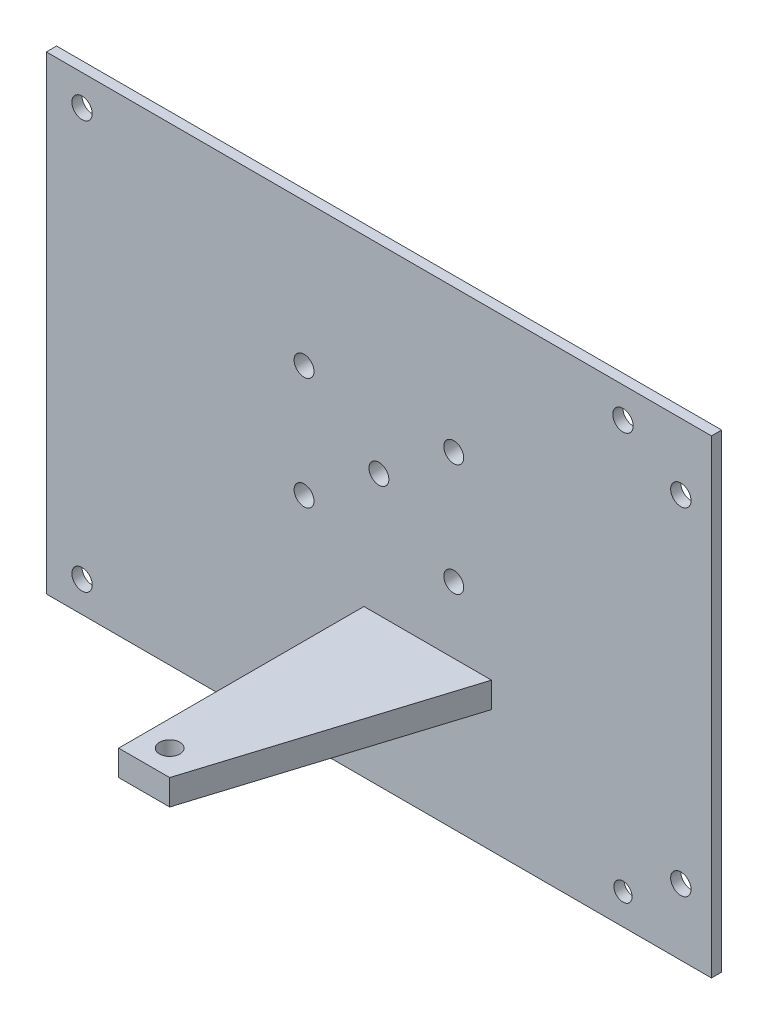
ISO-10303-21;
HEADER;
FILE_DESCRIPTION(('STEP AP214'),'2;1');
FILE_NAME('part.step','',(''),(''),'','','');
FILE_SCHEMA(('AUTOMOTIVE_DESIGN { 1 0 10303 214 1 1 1 1 }'));
ENDSEC;
DATA;
#1=APPLICATION_CONTEXT('core data for automotive mechanical design processes');
#2=APPLICATION_PROTOCOL_DEFINITION('international standard','automotive_design',2000,#1);
#3=PRODUCT_CONTEXT('',#1,'mechanical');
#4=PRODUCT('Part','Part','',(#3));
#5=PRODUCT_RELATED_PRODUCT_CATEGORY('part','',(#4));
#6=PRODUCT_DEFINITION_FORMATION('','',#4);
#7=PRODUCT_DEFINITION_CONTEXT('part definition',#1,'design');
#8=PRODUCT_DEFINITION('design','',#6,#7);
#9=PRODUCT_DEFINITION_SHAPE('','',#8);
#10=(LENGTH_UNIT() NAMED_UNIT(*) SI_UNIT(.MILLI.,.METRE.));
#11=(NAMED_UNIT(*) PLANE_ANGLE_UNIT() SI_UNIT($,.RADIAN.));
#12=(NAMED_UNIT(*) SI_UNIT($,.STERADIAN.) SOLID_ANGLE_UNIT());
#13=UNCERTAINTY_MEASURE_WITH_UNIT(LENGTH_MEASURE(1.E-05),#10,'distance_accuracy_value','');
#14=(GEOMETRIC_REPRESENTATION_CONTEXT(3) GLOBAL_UNCERTAINTY_ASSIGNED_CONTEXT((#13)) GLOBAL_UNIT_ASSIGNED_CONTEXT((#10,
#11,#12)) REPRESENTATION_CONTEXT('',''));
#15=CARTESIAN_POINT('',(0.,0.,0.));
#16=DIRECTION('',(0.,0.,1.));
#17=DIRECTION('',(1.,0.,0.));
#18=AXIS2_PLACEMENT_3D('',#15,#16,#17);
#19=CARTESIAN_POINT('',(0.,0.,-1.));
#20=DIRECTION('',(0.,0.,-1.));
#21=DIRECTION('',(-1.,0.,0.));
#22=AXIS2_PLACEMENT_3D('',#19,#20,#21);
#23=PLANE('',#22);
#24=CARTESIAN_POINT('',(113.,83.,-1.));
#25=DIRECTION('',(0.,0.,1.));
#26=DIRECTION('',(1.,0.,0.));
#27=AXIS2_PLACEMENT_3D('',#24,#25,#26);
#28=CIRCLE('',#27,2.);
#29=CARTESIAN_POINT('',(115.,83.,-1.));
#30=VERTEX_POINT('',#29);
#31=EDGE_CURVE('E184',#30,#30,#28,.T.);
#32=ORIENTED_EDGE('',*,*,#31,.T.);
#33=EDGE_LOOP('',(#32));
#34=FACE_BOUND('',#33,.T.);
#35=CARTESIAN_POINT('',(7.,3.,-1.));
#36=DIRECTION('',(0.,0.,1.));
#37=DIRECTION('',(1.,0.,0.));
#38=AXIS2_PLACEMENT_3D('',#35,#36,#37);
#39=CIRCLE('',#38,2.);
#40=CARTESIAN_POINT('',(9.,3.,-1.));
#41=VERTEX_POINT('',#40);
#42=EDGE_CURVE('E199',#41,#41,#39,.T.);
#43=ORIENTED_EDGE('',*,*,#42,.T.);
#44=EDGE_LOOP('',(#43));
#45=FACE_BOUND('',#44,.T.);
#46=CARTESIAN_POINT('',(124.33985981,76.,-1.));
#47=DIRECTION('',(0.,0.,1.));
#48=DIRECTION('',(1.,0.,0.));
#49=AXIS2_PLACEMENT_3D('',#46,#47,#48);
#50=CIRCLE('',#49,2.);
#51=CARTESIAN_POINT('',(126.33985981,76.,-1.));
#52=VERTEX_POINT('',#51);
#53=EDGE_CURVE('E211',#52,#52,#50,.T.);
#54=ORIENTED_EDGE('',*,*,#53,.T.);
#55=EDGE_LOOP('',(#54));
#56=FACE_BOUND('',#55,.T.);
#57=DIRECTION('',(0.,-1.,0.));
#58=VECTOR('',#57,1.);
#59=CARTESIAN_POINT('',(0.,-3.,-1.));
#60=LINE('',#59,#58);
#61=CARTESIAN_POINT('',(0.,89.,-1.));
#62=VERTEX_POINT('',#61);
#63=CARTESIAN_POINT('',(0.,-3.,-1.));
#64=VERTEX_POINT('',#63);
#65=EDGE_CURVE('E228',#62,#64,#60,.T.);
#66=ORIENTED_EDGE('',*,*,#65,.F.);
#67=DIRECTION('',(-1.,0.,0.));
#68=VECTOR('',#67,1.);
#69=CARTESIAN_POINT('',(0.,89.,-1.));
#70=LINE('',#69,#68);
#71=CARTESIAN_POINT('',(130.33985981,89.,-1.));
#72=VERTEX_POINT('',#71);
#73=EDGE_CURVE('E233',#72,#62,#70,.T.);
#74=ORIENTED_EDGE('',*,*,#73,.F.);
#75=DIRECTION('',(0.,1.,0.));
#76=VECTOR('',#75,1.);
#77=CARTESIAN_POINT('',(130.33985981,-3.,-1.));
#78=LINE('',#77,#76);
#79=CARTESIAN_POINT('',(130.33985981,-3.,-1.));
#80=VERTEX_POINT('',#79);
#81=EDGE_CURVE('E244',#80,#72,#78,.T.);
#82=ORIENTED_EDGE('',*,*,#81,.F.);
#83=DIRECTION('',(1.,0.,0.));
#84=VECTOR('',#83,1.);
#85=CARTESIAN_POINT('',(0.,-3.,-1.));
#86=LINE('',#85,#84);
#87=EDGE_CURVE('E242',#64,#80,#86,.T.);
#88=ORIENTED_EDGE('',*,*,#87,.F.);
#89=EDGE_LOOP('',(#66,#74,#82,#88));
#90=FACE_BOUND('',#89,.T.);
#91=CARTESIAN_POINT('',(124.33985981,10.,-1.));
#92=DIRECTION('',(0.,0.,1.));
#93=DIRECTION('',(1.,0.,0.));
#94=AXIS2_PLACEMENT_3D('',#91,#92,#93);
#95=CIRCLE('',#94,2.);
#96=CARTESIAN_POINT('',(126.33985981,10.,-1.));
#97=VERTEX_POINT('',#96);
#98=EDGE_CURVE('E217',#97,#97,#95,.T.);
#99=ORIENTED_EDGE('',*,*,#98,.T.);
#100=EDGE_LOOP('',(#99));
#101=FACE_BOUND('',#100,.T.);
#102=CARTESIAN_POINT('',(113.,3.,-1.));
#103=DIRECTION('',(0.,0.,1.));
#104=DIRECTION('',(1.,0.,0.));
#105=AXIS2_PLACEMENT_3D('',#102,#103,#104);
#106=CIRCLE('',#105,1.78558252323541);
#107=CARTESIAN_POINT('',(114.785582523235,3.,-1.));
#108=VERTEX_POINT('',#107);
#109=EDGE_CURVE('E205',#108,#108,#106,.T.);
#110=ORIENTED_EDGE('',*,*,#109,.T.);
#111=EDGE_LOOP('',(#110));
#112=FACE_BOUND('',#111,.T.);
#113=CARTESIAN_POINT('',(7.,83.,-1.));
#114=DIRECTION('',(0.,0.,1.));
#115=DIRECTION('',(1.,0.,0.));
#116=AXIS2_PLACEMENT_3D('',#113,#114,#115);
#117=CIRCLE('',#116,2.);
#118=CARTESIAN_POINT('',(9.,83.,-1.));
#119=VERTEX_POINT('',#118);
#120=EDGE_CURVE('E193',#119,#119,#117,.T.);
#121=ORIENTED_EDGE('',*,*,#120,.T.);
#122=EDGE_LOOP('',(#121));
#123=FACE_BOUND('',#122,.T.);
#124=DIRECTION('',(1.,0.,0.));
#125=VECTOR('',#124,1.);
#126=CARTESIAN_POINT('',(85.169929905,65.,-1.));
#127=LINE('',#126,#125);
#128=CARTESIAN_POINT('',(45.169929905,65.,-1.));
#129=VERTEX_POINT('',#128);
#130=CARTESIAN_POINT('',(85.169929905,65.,-1.));
#131=VERTEX_POINT('',#130);
#132=EDGE_CURVE('E416',#129,#131,#127,.T.);
#133=ORIENTED_EDGE('',*,*,#132,.F.);
#134=DIRECTION('',(0.,1.,0.));
#135=VECTOR('',#134,1.);
#136=CARTESIAN_POINT('',(45.169929905,65.,-1.));
#137=LINE('',#136,#135);
#138=CARTESIAN_POINT('',(45.169929905,35.,-1.));
#139=VERTEX_POINT('',#138);
#140=EDGE_CURVE('E147',#139,#129,#137,.T.);
#141=ORIENTED_EDGE('',*,*,#140,.F.);
#142=DIRECTION('',(-1.,0.,0.));
#143=VECTOR('',#142,1.);
#144=CARTESIAN_POINT('',(85.169929905,35.,-1.));
#145=LINE('',#144,#143);
#146=CARTESIAN_POINT('',(85.169929905,35.,-1.));
#147=VERTEX_POINT('',#146);
#148=EDGE_CURVE('E143',#147,#139,#145,.T.);
#149=ORIENTED_EDGE('',*,*,#148,.F.);
#150=DIRECTION('',(0.,-1.,0.));
#151=VECTOR('',#150,1.);
#152=CARTESIAN_POINT('',(85.169929905,65.,-1.));
#153=LINE('',#152,#151);
#154=EDGE_CURVE('E418',#131,#147,#153,.T.);
#155=ORIENTED_EDGE('',*,*,#154,.F.);
#156=EDGE_LOOP('',(#133,#141,#149,#155));
#157=FACE_BOUND('',#156,.T.);
#158=ADVANCED_FACE('F34',(#34,#45,#56,#90,#101,#112,#123,#157),#23,.T.);
#159=CARTESIAN_POINT('',(0.,0.,1.));
#160=DIRECTION('',(0.,0.,-1.));
#161=DIRECTION('',(-1.,0.,0.));
#162=AXIS2_PLACEMENT_3D('',#159,#160,#161);
#163=PLANE('',#162);
#164=CARTESIAN_POINT('',(50.5032632383334,61.,1.));
#165=DIRECTION('',(0.,0.,-1.));
#166=DIRECTION('',(-1.,0.,0.));
#167=AXIS2_PLACEMENT_3D('',#164,#165,#166);
#168=CIRCLE('',#167,1.95000000000001);
#169=CARTESIAN_POINT('',(48.5532632383334,61.,1.));
#170=VERTEX_POINT('',#169);
#171=EDGE_CURVE('E395',#170,#170,#168,.T.);
#172=ORIENTED_EDGE('',*,*,#171,.T.);
#173=EDGE_LOOP('',(#172));
#174=FACE_BOUND('',#173,.T.);
#175=CARTESIAN_POINT('',(79.8365965716667,61.,1.));
#176=DIRECTION('',(0.,0.,-1.));
#177=DIRECTION('',(-1.,0.,0.));
#178=AXIS2_PLACEMENT_3D('',#175,#176,#177);
#179=CIRCLE('',#178,1.94999999999999);
#180=CARTESIAN_POINT('',(77.8865965716667,61.,1.));
#181=VERTEX_POINT('',#180);
#182=EDGE_CURVE('E389',#181,#181,#179,.T.);
#183=ORIENTED_EDGE('',*,*,#182,.T.);
#184=EDGE_LOOP('',(#183));
#185=FACE_BOUND('',#184,.T.);
#186=CARTESIAN_POINT('',(79.8365965716667,39.,1.));
#187=DIRECTION('',(0.,0.,-1.));
#188=DIRECTION('',(-1.,0.,0.));
#189=AXIS2_PLACEMENT_3D('',#186,#187,#188);
#190=CIRCLE('',#189,1.95);
#191=CARTESIAN_POINT('',(77.8865965716667,39.,1.));
#192=VERTEX_POINT('',#191);
#193=EDGE_CURVE('E386',#192,#192,#190,.T.);
#194=ORIENTED_EDGE('',*,*,#193,.T.);
#195=EDGE_LOOP('',(#194));
#196=FACE_BOUND('',#195,.T.);
#197=CARTESIAN_POINT('',(50.5032632383334,39.,1.));
#198=DIRECTION('',(0.,0.,-1.));
#199=DIRECTION('',(-1.,0.,0.));
#200=AXIS2_PLACEMENT_3D('',#197,#198,#199);
#201=CIRCLE('',#200,1.95);
#202=CARTESIAN_POINT('',(48.5532632383334,39.,1.));
#203=VERTEX_POINT('',#202);
#204=EDGE_CURVE('E388',#203,#203,#201,.T.);
#205=ORIENTED_EDGE('',*,*,#204,.T.);
#206=EDGE_LOOP('',(#205));
#207=FACE_BOUND('',#206,.T.);
#208=DIRECTION('',(0.,-1.,0.));
#209=VECTOR('',#208,1.);
#210=CARTESIAN_POINT('',(62.24,26.,1.));
#211=LINE('',#210,#209);
#212=CARTESIAN_POINT('',(62.24,26.,1.));
#213=VERTEX_POINT('',#212);
#214=CARTESIAN_POINT('',(62.24,21.,1.));
#215=VERTEX_POINT('',#214);
#216=EDGE_CURVE('E57',#213,#215,#211,.T.);
#217=ORIENTED_EDGE('',*,*,#216,.F.);
#218=DIRECTION('',(1.,0.,0.));
#219=VECTOR('',#218,1.);
#220=CARTESIAN_POINT('',(62.24,26.,1.));
#221=LINE('',#220,#219);
#222=CARTESIAN_POINT('',(87.24,26.,1.));
#223=VERTEX_POINT('',#222);
#224=EDGE_CURVE('E160',#213,#223,#221,.T.);
#225=ORIENTED_EDGE('',*,*,#224,.T.);
#226=DIRECTION('',(0.,-1.,0.));
#227=VECTOR('',#226,1.);
#228=CARTESIAN_POINT('',(87.24,26.,1.));
#229=LINE('',#228,#227);
#230=CARTESIAN_POINT('',(87.24,21.,1.));
#231=VERTEX_POINT('',#230);
#232=EDGE_CURVE('E172',#223,#231,#229,.T.);
#233=ORIENTED_EDGE('',*,*,#232,.T.);
#234=DIRECTION('',(1.,0.,0.));
#235=VECTOR('',#234,1.);
#236=CARTESIAN_POINT('',(62.24,21.,1.));
#237=LINE('',#236,#235);
#238=EDGE_CURVE('E158',#215,#231,#237,.T.);
#239=ORIENTED_EDGE('',*,*,#238,.F.);
#240=EDGE_LOOP('',(#217,#225,#233,#239));
#241=FACE_BOUND('',#240,.T.);
#242=DIRECTION('',(0.,-1.,0.));
#243=VECTOR('',#242,1.);
#244=CARTESIAN_POINT('',(0.,-3.,1.));
#245=LINE('',#244,#243);
#246=CARTESIAN_POINT('',(0.,89.,1.));
#247=VERTEX_POINT('',#246);
#248=CARTESIAN_POINT('',(0.,-3.,1.));
#249=VERTEX_POINT('',#248);
#250=EDGE_CURVE('E229',#247,#249,#245,.T.);
#251=ORIENTED_EDGE('',*,*,#250,.T.);
#252=DIRECTION('',(1.,0.,0.));
#253=VECTOR('',#252,1.);
#254=CARTESIAN_POINT('',(0.,-3.,1.));
#255=LINE('',#254,#253);
#256=CARTESIAN_POINT('',(130.33985981,-3.,1.));
#257=VERTEX_POINT('',#256);
#258=EDGE_CURVE('E232',#249,#257,#255,.T.);
#259=ORIENTED_EDGE('',*,*,#258,.T.);
#260=DIRECTION('',(0.,1.,0.));
#261=VECTOR('',#260,1.);
#262=CARTESIAN_POINT('',(130.33985981,-3.,1.));
#263=LINE('',#262,#261);
#264=CARTESIAN_POINT('',(130.33985981,89.,1.));
#265=VERTEX_POINT('',#264);
#266=EDGE_CURVE('E235',#257,#265,#263,.T.);
#267=ORIENTED_EDGE('',*,*,#266,.T.);
#268=DIRECTION('',(-1.,0.,0.));
#269=VECTOR('',#268,1.);
#270=CARTESIAN_POINT('',(0.,89.,1.));
#271=LINE('',#270,#269);
#272=EDGE_CURVE('E237',#265,#247,#271,.T.);
#273=ORIENTED_EDGE('',*,*,#272,.T.);
#274=EDGE_LOOP('',(#251,#259,#267,#273));
#275=FACE_BOUND('',#274,.T.);
#276=CARTESIAN_POINT('',(65.169929905,50.,1.));
#277=DIRECTION('',(0.,0.,1.));
#278=DIRECTION('',(1.,0.,0.));
#279=AXIS2_PLACEMENT_3D('',#276,#277,#278);
#280=CIRCLE('',#279,1.95);
#281=CARTESIAN_POINT('',(67.119929905,50.,1.));
#282=VERTEX_POINT('',#281);
#283=EDGE_CURVE('E223',#282,#282,#280,.T.);
#284=ORIENTED_EDGE('',*,*,#283,.F.);
#285=EDGE_LOOP('',(#284));
#286=FACE_BOUND('',#285,.T.);
#287=CARTESIAN_POINT('',(124.33985981,10.,1.));
#288=DIRECTION('',(0.,0.,1.));
#289=DIRECTION('',(1.,0.,0.));
#290=AXIS2_PLACEMENT_3D('',#287,#288,#289);
#291=CIRCLE('',#290,2.);
#292=CARTESIAN_POINT('',(126.33985981,10.,1.));
#293=VERTEX_POINT('',#292);
#294=EDGE_CURVE('E220',#293,#293,#291,.T.);
#295=ORIENTED_EDGE('',*,*,#294,.F.);
#296=EDGE_LOOP('',(#295));
#297=FACE_BOUND('',#296,.T.);
#298=CARTESIAN_POINT('',(124.33985981,76.,1.));
#299=DIRECTION('',(0.,0.,1.));
#300=DIRECTION('',(1.,0.,0.));
#301=AXIS2_PLACEMENT_3D('',#298,#299,#300);
#302=CIRCLE('',#301,2.);
#303=CARTESIAN_POINT('',(126.33985981,76.,1.));
#304=VERTEX_POINT('',#303);
#305=EDGE_CURVE('E214',#304,#304,#302,.T.);
#306=ORIENTED_EDGE('',*,*,#305,.F.);
#307=EDGE_LOOP('',(#306));
#308=FACE_BOUND('',#307,.T.);
#309=CARTESIAN_POINT('',(113.,3.,1.));
#310=DIRECTION('',(0.,0.,1.));
#311=DIRECTION('',(1.,0.,0.));
#312=AXIS2_PLACEMENT_3D('',#309,#310,#311);
#313=CIRCLE('',#312,1.78558252323541);
#314=CARTESIAN_POINT('',(114.785582523235,3.,1.));
#315=VERTEX_POINT('',#314);
#316=EDGE_CURVE('E208',#315,#315,#313,.T.);
#317=ORIENTED_EDGE('',*,*,#316,.F.);
#318=EDGE_LOOP('',(#317));
#319=FACE_BOUND('',#318,.T.);
#320=CARTESIAN_POINT('',(7.,3.,1.));
#321=DIRECTION('',(0.,0.,1.));
#322=DIRECTION('',(1.,0.,0.));
#323=AXIS2_PLACEMENT_3D('',#320,#321,#322);
#324=CIRCLE('',#323,2.);
#325=CARTESIAN_POINT('',(9.,3.,1.));
#326=VERTEX_POINT('',#325);
#327=EDGE_CURVE('E202',#326,#326,#324,.T.);
#328=ORIENTED_EDGE('',*,*,#327,.F.);
#329=EDGE_LOOP('',(#328));
#330=FACE_BOUND('',#329,.T.);
#331=CARTESIAN_POINT('',(7.,83.,1.));
#332=DIRECTION('',(0.,0.,1.));
#333=DIRECTION('',(1.,0.,0.));
#334=AXIS2_PLACEMENT_3D('',#331,#332,#333);
#335=CIRCLE('',#334,2.);
#336=CARTESIAN_POINT('',(9.,83.,1.));
#337=VERTEX_POINT('',#336);
#338=EDGE_CURVE('E196',#337,#337,#335,.T.);
#339=ORIENTED_EDGE('',*,*,#338,.F.);
#340=EDGE_LOOP('',(#339));
#341=FACE_BOUND('',#340,.T.);
#342=CARTESIAN_POINT('',(113.,83.,1.));
#343=DIRECTION('',(0.,0.,1.));
#344=DIRECTION('',(1.,0.,0.));
#345=AXIS2_PLACEMENT_3D('',#342,#343,#344);
#346=CIRCLE('',#345,2.);
#347=CARTESIAN_POINT('',(115.,83.,1.));
#348=VERTEX_POINT('',#347);
#349=EDGE_CURVE('E190',#348,#348,#346,.T.);
#350=ORIENTED_EDGE('',*,*,#349,.F.);
#351=EDGE_LOOP('',(#350));
#352=FACE_BOUND('',#351,.T.);
#353=ADVANCED_FACE('F271',(#174,#185,#196,#207,#241,#275,#286,#297,#308,#319,#330,#341,#352),
#163,.F.);
#354=CARTESIAN_POINT('',(0.,-3.,1.));
#355=DIRECTION('',(1.,0.,0.));
#356=DIRECTION('',(0.,0.,-1.));
#357=AXIS2_PLACEMENT_3D('',#354,#355,#356);
#358=PLANE('',#357);
#359=ORIENTED_EDGE('',*,*,#65,.T.);
#360=DIRECTION('',(0.,0.,-1.));
#361=VECTOR('',#360,1.);
#362=CARTESIAN_POINT('',(0.,-3.,1.));
#363=LINE('',#362,#361);
#364=EDGE_CURVE('E11',#249,#64,#363,.T.);
#365=ORIENTED_EDGE('',*,*,#364,.F.);
#366=ORIENTED_EDGE('',*,*,#250,.F.);
#367=DIRECTION('',(0.,0.,-1.));
#368=VECTOR('',#367,1.);
#369=CARTESIAN_POINT('',(0.,89.,1.));
#370=LINE('',#369,#368);
#371=EDGE_CURVE('E239',#247,#62,#370,.T.);
#372=ORIENTED_EDGE('',*,*,#371,.T.);
#373=EDGE_LOOP('',(#359,#365,#366,#372));
#374=FACE_BOUND('',#373,.T.);
#375=ADVANCED_FACE('F36',(#374),#358,.F.);
#376=CARTESIAN_POINT('',(0.,-3.,1.));
#377=DIRECTION('',(0.,1.,0.));
#378=DIRECTION('',(0.,0.,1.));
#379=AXIS2_PLACEMENT_3D('',#376,#377,#378);
#380=PLANE('',#379);
#381=ORIENTED_EDGE('',*,*,#87,.T.);
#382=DIRECTION('',(0.,0.,-1.));
#383=VECTOR('',#382,1.);
#384=CARTESIAN_POINT('',(130.33985981,-3.,1.));
#385=LINE('',#384,#383);
#386=EDGE_CURVE('E42',#257,#80,#385,.T.);
#387=ORIENTED_EDGE('',*,*,#386,.F.);
#388=ORIENTED_EDGE('',*,*,#258,.F.);
#389=ORIENTED_EDGE('',*,*,#364,.T.);
#390=EDGE_LOOP('',(#381,#387,#388,#389));
#391=FACE_BOUND('',#390,.T.);
#392=ADVANCED_FACE('F273',(#391),#380,.F.);
#393=CARTESIAN_POINT('',(130.33985981,-3.,1.));
#394=DIRECTION('',(-1.,0.,0.));
#395=DIRECTION('',(0.,-1.,0.));
#396=AXIS2_PLACEMENT_3D('',#393,#394,#395);
#397=PLANE('',#396);
#398=ORIENTED_EDGE('',*,*,#81,.T.);
#399=DIRECTION('',(0.,0.,-1.));
#400=VECTOR('',#399,1.);
#401=CARTESIAN_POINT('',(130.33985981,89.,1.));
#402=LINE('',#401,#400);
#403=EDGE_CURVE('E249',#265,#72,#402,.T.);
#404=ORIENTED_EDGE('',*,*,#403,.F.);
#405=ORIENTED_EDGE('',*,*,#266,.F.);
#406=ORIENTED_EDGE('',*,*,#386,.T.);
#407=EDGE_LOOP('',(#398,#404,#405,#406));
#408=FACE_BOUND('',#407,.T.);
#409=ADVANCED_FACE('F256',(#408),#397,.F.);
#410=CARTESIAN_POINT('',(0.,89.,1.));
#411=DIRECTION('',(0.,-1.,0.));
#412=DIRECTION('',(0.,0.,-1.));
#413=AXIS2_PLACEMENT_3D('',#410,#411,#412);
#414=PLANE('',#413);
#415=ORIENTED_EDGE('',*,*,#73,.T.);
#416=ORIENTED_EDGE('',*,*,#371,.F.);
#417=ORIENTED_EDGE('',*,*,#272,.F.);
#418=ORIENTED_EDGE('',*,*,#403,.T.);
#419=EDGE_LOOP('',(#415,#416,#417,#418));
#420=FACE_BOUND('',#419,.T.);
#421=ADVANCED_FACE('F265',(#420),#414,.F.);
#422=CARTESIAN_POINT('',(65.169929905,50.,1.));
#423=DIRECTION('',(0.,0.,-1.));
#424=DIRECTION('',(-1.,0.,0.));
#425=AXIS2_PLACEMENT_3D('',#422,#423,#424);
#426=CYLINDRICAL_SURFACE('',#425,1.95);
#427=ORIENTED_EDGE('',*,*,#283,.T.);
#428=EDGE_LOOP('',(#427));
#429=FACE_BOUND('',#428,.T.);
#430=CARTESIAN_POINT('',(65.169929905,50.,-7.));
#431=DIRECTION('',(0.,0.,-1.));
#432=DIRECTION('',(-1.,0.,0.));
#433=AXIS2_PLACEMENT_3D('',#430,#431,#432);
#434=CIRCLE('',#433,1.95);
#435=CARTESIAN_POINT('',(63.219929905,50.,-7.));
#436=VERTEX_POINT('',#435);
#437=EDGE_CURVE('E392',#436,#436,#434,.T.);
#438=ORIENTED_EDGE('',*,*,#437,.T.);
#439=EDGE_LOOP('',(#438));
#440=FACE_BOUND('',#439,.T.);
#441=ADVANCED_FACE('F292',(#429,#440),#426,.F.);
#442=CARTESIAN_POINT('',(124.33985981,10.,1.));
#443=DIRECTION('',(0.,0.,-1.));
#444=DIRECTION('',(-1.,0.,0.));
#445=AXIS2_PLACEMENT_3D('',#442,#443,#444);
#446=CYLINDRICAL_SURFACE('',#445,2.);
#447=ORIENTED_EDGE('',*,*,#294,.T.);
#448=EDGE_LOOP('',(#447));
#449=FACE_BOUND('',#448,.T.);
#450=ORIENTED_EDGE('',*,*,#98,.F.);
#451=EDGE_LOOP('',(#450));
#452=FACE_BOUND('',#451,.T.);
#453=ADVANCED_FACE('F296',(#449,#452),#446,.F.);
#454=CARTESIAN_POINT('',(124.33985981,76.,1.));
#455=DIRECTION('',(0.,0.,-1.));
#456=DIRECTION('',(-1.,0.,0.));
#457=AXIS2_PLACEMENT_3D('',#454,#455,#456);
#458=CYLINDRICAL_SURFACE('',#457,2.);
#459=ORIENTED_EDGE('',*,*,#305,.T.);
#460=EDGE_LOOP('',(#459));
#461=FACE_BOUND('',#460,.T.);
#462=ORIENTED_EDGE('',*,*,#53,.F.);
#463=EDGE_LOOP('',(#462));
#464=FACE_BOUND('',#463,.T.);
#465=ADVANCED_FACE('F301',(#461,#464),#458,.F.);
#466=CARTESIAN_POINT('',(113.,3.,1.));
#467=DIRECTION('',(0.,0.,-1.));
#468=DIRECTION('',(-1.,0.,0.));
#469=AXIS2_PLACEMENT_3D('',#466,#467,#468);
#470=CYLINDRICAL_SURFACE('',#469,1.78558252323541);
#471=ORIENTED_EDGE('',*,*,#316,.T.);
#472=EDGE_LOOP('',(#471));
#473=FACE_BOUND('',#472,.T.);
#474=ORIENTED_EDGE('',*,*,#109,.F.);
#475=EDGE_LOOP('',(#474));
#476=FACE_BOUND('',#475,.T.);
#477=ADVANCED_FACE('F308',(#473,#476),#470,.F.);
#478=CARTESIAN_POINT('',(7.,3.,1.));
#479=DIRECTION('',(0.,0.,-1.));
#480=DIRECTION('',(-1.,0.,0.));
#481=AXIS2_PLACEMENT_3D('',#478,#479,#480);
#482=CYLINDRICAL_SURFACE('',#481,2.);
#483=ORIENTED_EDGE('',*,*,#327,.T.);
#484=EDGE_LOOP('',(#483));
#485=FACE_BOUND('',#484,.T.);
#486=ORIENTED_EDGE('',*,*,#42,.F.);
#487=EDGE_LOOP('',(#486));
#488=FACE_BOUND('',#487,.T.);
#489=ADVANCED_FACE('F312',(#485,#488),#482,.F.);
#490=CARTESIAN_POINT('',(7.,83.,1.));
#491=DIRECTION('',(0.,0.,-1.));
#492=DIRECTION('',(-1.,0.,0.));
#493=AXIS2_PLACEMENT_3D('',#490,#491,#492);
#494=CYLINDRICAL_SURFACE('',#493,2.);
#495=ORIENTED_EDGE('',*,*,#338,.T.);
#496=EDGE_LOOP('',(#495));
#497=FACE_BOUND('',#496,.T.);
#498=ORIENTED_EDGE('',*,*,#120,.F.);
#499=EDGE_LOOP('',(#498));
#500=FACE_BOUND('',#499,.T.);
#501=ADVANCED_FACE('F316',(#497,#500),#494,.F.);
#502=CARTESIAN_POINT('',(113.,83.,1.));
#503=DIRECTION('',(0.,0.,-1.));
#504=DIRECTION('',(-1.,0.,0.));
#505=AXIS2_PLACEMENT_3D('',#502,#503,#504);
#506=CYLINDRICAL_SURFACE('',#505,2.);
#507=ORIENTED_EDGE('',*,*,#349,.T.);
#508=EDGE_LOOP('',(#507));
#509=FACE_BOUND('',#508,.T.);
#510=ORIENTED_EDGE('',*,*,#31,.F.);
#511=EDGE_LOOP('',(#510));
#512=FACE_BOUND('',#511,.T.);
#513=ADVANCED_FACE('F320',(#509,#512),#506,.F.);
#514=CARTESIAN_POINT('',(62.24,26.,49.07));
#515=DIRECTION('',(-1.,0.,0.));
#516=DIRECTION('',(0.,0.,1.));
#517=AXIS2_PLACEMENT_3D('',#514,#515,#516);
#518=PLANE('',#517);
#519=DIRECTION('',(0.,0.,-1.));
#520=VECTOR('',#519,1.);
#521=CARTESIAN_POINT('',(62.24,21.,49.07));
#522=LINE('',#521,#520);
#523=CARTESIAN_POINT('',(62.24,21.,49.07));
#524=VERTEX_POINT('',#523);
#525=EDGE_CURVE('E163',#524,#215,#522,.T.);
#526=ORIENTED_EDGE('',*,*,#525,.F.);
#527=DIRECTION('',(0.,-1.,0.));
#528=VECTOR('',#527,1.);
#529=CARTESIAN_POINT('',(62.24,26.,49.07));
#530=LINE('',#529,#528);
#531=CARTESIAN_POINT('',(62.24,26.,49.07));
#532=VERTEX_POINT('',#531);
#533=EDGE_CURVE('E185',#532,#524,#530,.T.);
#534=ORIENTED_EDGE('',*,*,#533,.F.);
#535=DIRECTION('',(0.,0.,-1.));
#536=VECTOR('',#535,1.);
#537=CARTESIAN_POINT('',(62.24,26.,49.07));
#538=LINE('',#537,#536);
#539=EDGE_CURVE('E169',#532,#213,#538,.T.);
#540=ORIENTED_EDGE('',*,*,#539,.T.);
#541=ORIENTED_EDGE('',*,*,#216,.T.);
#542=EDGE_LOOP('',(#526,#534,#540,#541));
#543=FACE_BOUND('',#542,.T.);
#544=ADVANCED_FACE('F324',(#543),#518,.T.);
#545=CARTESIAN_POINT('',(62.24,26.,49.07));
#546=DIRECTION('',(0.,0.,1.));
#547=DIRECTION('',(1.,0.,0.));
#548=AXIS2_PLACEMENT_3D('',#545,#546,#547);
#549=PLANE('',#548);
#550=DIRECTION('',(-1.,0.,0.));
#551=VECTOR('',#550,1.);
#552=CARTESIAN_POINT('',(62.24,21.,49.07));
#553=LINE('',#552,#551);
#554=CARTESIAN_POINT('',(72.24,21.,49.07));
#555=VERTEX_POINT('',#554);
#556=EDGE_CURVE('E178',#555,#524,#553,.T.);
#557=ORIENTED_EDGE('',*,*,#556,.F.);
#558=DIRECTION('',(0.,-1.,0.));
#559=VECTOR('',#558,1.);
#560=CARTESIAN_POINT('',(72.24,26.,49.07));
#561=LINE('',#560,#559);
#562=CARTESIAN_POINT('',(72.24,26.,49.07));
#563=VERTEX_POINT('',#562);
#564=EDGE_CURVE('E187',#563,#555,#561,.T.);
#565=ORIENTED_EDGE('',*,*,#564,.F.);
#566=DIRECTION('',(-1.,0.,0.));
#567=VECTOR('',#566,1.);
#568=CARTESIAN_POINT('',(62.24,26.,49.07));
#569=LINE('',#568,#567);
#570=EDGE_CURVE('E166',#563,#532,#569,.T.);
#571=ORIENTED_EDGE('',*,*,#570,.T.);
#572=ORIENTED_EDGE('',*,*,#533,.T.);
#573=EDGE_LOOP('',(#557,#565,#571,#572));
#574=FACE_BOUND('',#573,.T.);
#575=ADVANCED_FACE('F330',(#574),#549,.T.);
#576=CARTESIAN_POINT('',(72.24,26.,49.07));
#577=DIRECTION('',(0.95460357062948,0.,0.297879208642442));
#578=DIRECTION('',(0.297879208642442,0.,-0.95460357062948));
#579=AXIS2_PLACEMENT_3D('',#576,#577,#578);
#580=PLANE('',#579);
#581=DIRECTION('',(-0.297879208642442,0.,0.95460357062948));
#582=VECTOR('',#581,1.);
#583=CARTESIAN_POINT('',(72.24,21.,49.07));
#584=LINE('',#583,#582);
#585=EDGE_CURVE('E175',#231,#555,#584,.T.);
#586=ORIENTED_EDGE('',*,*,#585,.F.);
#587=ORIENTED_EDGE('',*,*,#232,.F.);
#588=DIRECTION('',(-0.297879208642442,0.,0.95460357062948));
#589=VECTOR('',#588,1.);
#590=CARTESIAN_POINT('',(72.24,26.,49.07));
#591=LINE('',#590,#589);
#592=EDGE_CURVE('E162',#223,#563,#591,.T.);
#593=ORIENTED_EDGE('',*,*,#592,.T.);
#594=ORIENTED_EDGE('',*,*,#564,.T.);
#595=EDGE_LOOP('',(#586,#587,#593,#594));
#596=FACE_BOUND('',#595,.T.);
#597=ADVANCED_FACE('F326',(#596),#580,.T.);
#598=CARTESIAN_POINT('',(0.,26.,0.));
#599=DIRECTION('',(0.,1.,0.));
#600=DIRECTION('',(0.,0.,1.));
#601=AXIS2_PLACEMENT_3D('',#598,#599,#600);
#602=PLANE('',#601);
#603=CARTESIAN_POINT('',(67.24,26.,44.07));
#604=DIRECTION('',(0.,-1.,0.));
#605=DIRECTION('',(0.,0.,-1.));
#606=AXIS2_PLACEMENT_3D('',#603,#604,#605);
#607=CIRCLE('',#606,2.);
#608=CARTESIAN_POINT('',(67.24,26.,42.07));
#609=VERTEX_POINT('',#608);
#610=EDGE_CURVE('E152',#609,#609,#607,.T.);
#611=ORIENTED_EDGE('',*,*,#610,.T.);
#612=EDGE_LOOP('',(#611));
#613=FACE_BOUND('',#612,.T.);
#614=ORIENTED_EDGE('',*,*,#224,.F.);
#615=ORIENTED_EDGE('',*,*,#539,.F.);
#616=ORIENTED_EDGE('',*,*,#570,.F.);
#617=ORIENTED_EDGE('',*,*,#592,.F.);
#618=EDGE_LOOP('',(#614,#615,#616,#617));
#619=FACE_BOUND('',#618,.T.);
#620=ADVANCED_FACE('F329',(#613,#619),#602,.T.);
#621=CARTESIAN_POINT('',(0.,21.,0.));
#622=DIRECTION('',(0.,1.,0.));
#623=DIRECTION('',(0.,0.,1.));
#624=AXIS2_PLACEMENT_3D('',#621,#622,#623);
#625=PLANE('',#624);
#626=CARTESIAN_POINT('',(67.24,21.,44.07));
#627=DIRECTION('',(0.,-1.,0.));
#628=DIRECTION('',(0.,0.,-1.));
#629=AXIS2_PLACEMENT_3D('',#626,#627,#628);
#630=CIRCLE('',#629,2.);
#631=CARTESIAN_POINT('',(67.24,21.,42.07));
#632=VERTEX_POINT('',#631);
#633=EDGE_CURVE('E149',#632,#632,#630,.T.);
#634=ORIENTED_EDGE('',*,*,#633,.F.);
#635=EDGE_LOOP('',(#634));
#636=FACE_BOUND('',#635,.T.);
#637=ORIENTED_EDGE('',*,*,#238,.T.);
#638=ORIENTED_EDGE('',*,*,#585,.T.);
#639=ORIENTED_EDGE('',*,*,#556,.T.);
#640=ORIENTED_EDGE('',*,*,#525,.T.);
#641=EDGE_LOOP('',(#637,#638,#639,#640));
#642=FACE_BOUND('',#641,.T.);
#643=ADVANCED_FACE('F338',(#636,#642),#625,.F.);
#644=CARTESIAN_POINT('',(67.24,26.,44.07));
#645=DIRECTION('',(0.,-1.,0.));
#646=DIRECTION('',(0.,0.,-1.));
#647=AXIS2_PLACEMENT_3D('',#644,#645,#646);
#648=CYLINDRICAL_SURFACE('',#647,2.);
#649=ORIENTED_EDGE('',*,*,#610,.F.);
#650=EDGE_LOOP('',(#649));
#651=FACE_BOUND('',#650,.T.);
#652=ORIENTED_EDGE('',*,*,#633,.T.);
#653=EDGE_LOOP('',(#652));
#654=FACE_BOUND('',#653,.T.);
#655=ADVANCED_FACE('F341',(#651,#654),#648,.F.);
#656=CARTESIAN_POINT('',(0.,0.,-7.));
#657=DIRECTION('',(0.,0.,-1.));
#658=DIRECTION('',(-1.,0.,0.));
#659=AXIS2_PLACEMENT_3D('',#656,#657,#658);
#660=PLANE('',#659);
#661=CARTESIAN_POINT('',(79.8365965716667,39.,-7.));
#662=DIRECTION('',(0.,0.,-1.));
#663=DIRECTION('',(-1.,0.,0.));
#664=AXIS2_PLACEMENT_3D('',#661,#662,#663);
#665=CIRCLE('',#664,1.95);
#666=CARTESIAN_POINT('',(77.8865965716667,39.,-7.));
#667=VERTEX_POINT('',#666);
#668=EDGE_CURVE('E383',#667,#667,#665,.T.);
#669=ORIENTED_EDGE('',*,*,#668,.F.);
#670=EDGE_LOOP('',(#669));
#671=FACE_BOUND('',#670,.T.);
#672=CARTESIAN_POINT('',(50.5032632383334,61.,-7.));
#673=DIRECTION('',(0.,0.,-1.));
#674=DIRECTION('',(-1.,0.,0.));
#675=AXIS2_PLACEMENT_3D('',#672,#673,#674);
#676=CIRCLE('',#675,1.95);
#677=CARTESIAN_POINT('',(48.5532632383334,61.,-7.));
#678=VERTEX_POINT('',#677);
#679=EDGE_CURVE('E406',#678,#678,#676,.T.);
#680=ORIENTED_EDGE('',*,*,#679,.F.);
#681=EDGE_LOOP('',(#680));
#682=FACE_BOUND('',#681,.T.);
#683=DIRECTION('',(0.,1.,0.));
#684=VECTOR('',#683,1.);
#685=CARTESIAN_POINT('',(45.169929905,65.,-7.));
#686=LINE('',#685,#684);
#687=CARTESIAN_POINT('',(45.169929905,35.,-7.));
#688=VERTEX_POINT('',#687);
#689=CARTESIAN_POINT('',(45.169929905,65.,-7.));
#690=VERTEX_POINT('',#689);
#691=EDGE_CURVE('E134',#688,#690,#686,.T.);
#692=ORIENTED_EDGE('',*,*,#691,.T.);
#693=DIRECTION('',(1.,0.,0.));
#694=VECTOR('',#693,1.);
#695=CARTESIAN_POINT('',(85.169929905,65.,-7.));
#696=LINE('',#695,#694);
#697=CARTESIAN_POINT('',(85.169929905,65.,-7.));
#698=VERTEX_POINT('',#697);
#699=EDGE_CURVE('E123',#690,#698,#696,.T.);
#700=ORIENTED_EDGE('',*,*,#699,.T.);
#701=DIRECTION('',(0.,-1.,0.));
#702=VECTOR('',#701,1.);
#703=CARTESIAN_POINT('',(85.169929905,65.,-7.));
#704=LINE('',#703,#702);
#705=CARTESIAN_POINT('',(85.169929905,35.,-7.));
#706=VERTEX_POINT('',#705);
#707=EDGE_CURVE('E133',#698,#706,#704,.T.);
#708=ORIENTED_EDGE('',*,*,#707,.T.);
#709=DIRECTION('',(-1.,0.,0.));
#710=VECTOR('',#709,1.);
#711=CARTESIAN_POINT('',(85.169929905,35.,-7.));
#712=LINE('',#711,#710);
#713=EDGE_CURVE('E139',#706,#688,#712,.T.);
#714=ORIENTED_EDGE('',*,*,#713,.T.);
#715=EDGE_LOOP('',(#692,#700,#708,#714));
#716=FACE_BOUND('',#715,.T.);
#717=CARTESIAN_POINT('',(79.8365965716667,61.,-7.));
#718=DIRECTION('',(0.,0.,-1.));
#719=DIRECTION('',(-1.,0.,0.));
#720=AXIS2_PLACEMENT_3D('',#717,#718,#719);
#721=CIRCLE('',#720,1.95);
#722=CARTESIAN_POINT('',(77.8865965716667,61.,-7.));
#723=VERTEX_POINT('',#722);
#724=EDGE_CURVE('E409',#723,#723,#721,.T.);
#725=ORIENTED_EDGE('',*,*,#724,.F.);
#726=EDGE_LOOP('',(#725));
#727=FACE_BOUND('',#726,.T.);
#728=CARTESIAN_POINT('',(50.5032632383334,39.,-7.));
#729=DIRECTION('',(0.,0.,-1.));
#730=DIRECTION('',(-1.,0.,0.));
#731=AXIS2_PLACEMENT_3D('',#728,#729,#730);
#732=CIRCLE('',#731,1.95);
#733=CARTESIAN_POINT('',(48.5532632383334,39.,-7.));
#734=VERTEX_POINT('',#733);
#735=EDGE_CURVE('E403',#734,#734,#732,.T.);
#736=ORIENTED_EDGE('',*,*,#735,.F.);
#737=EDGE_LOOP('',(#736));
#738=FACE_BOUND('',#737,.T.);
#739=ORIENTED_EDGE('',*,*,#437,.F.);
#740=EDGE_LOOP('',(#739));
#741=FACE_BOUND('',#740,.T.);
#742=ADVANCED_FACE('F137',(#671,#682,#716,#727,#738,#741),#660,.T.);
#743=CARTESIAN_POINT('',(45.169929905,65.,-7.));
#744=DIRECTION('',(1.,0.,0.));
#745=DIRECTION('',(0.,1.,0.));
#746=AXIS2_PLACEMENT_3D('',#743,#744,#745);
#747=PLANE('',#746);
#748=ORIENTED_EDGE('',*,*,#140,.T.);
#749=DIRECTION('',(0.,0.,1.));
#750=VECTOR('',#749,1.);
#751=CARTESIAN_POINT('',(45.169929905,65.,-7.));
#752=LINE('',#751,#750);
#753=EDGE_CURVE('E127',#690,#129,#752,.T.);
#754=ORIENTED_EDGE('',*,*,#753,.F.);
#755=ORIENTED_EDGE('',*,*,#691,.F.);
#756=DIRECTION('',(0.,0.,1.));
#757=VECTOR('',#756,1.);
#758=CARTESIAN_POINT('',(45.169929905,35.,-7.));
#759=LINE('',#758,#757);
#760=EDGE_CURVE('E414',#688,#139,#759,.T.);
#761=ORIENTED_EDGE('',*,*,#760,.T.);
#762=EDGE_LOOP('',(#748,#754,#755,#761));
#763=FACE_BOUND('',#762,.T.);
#764=ADVANCED_FACE('F145',(#763),#747,.F.);
#765=CARTESIAN_POINT('',(85.169929905,65.,-7.));
#766=DIRECTION('',(0.,-1.,0.));
#767=DIRECTION('',(0.,0.,-1.));
#768=AXIS2_PLACEMENT_3D('',#765,#766,#767);
#769=PLANE('',#768);
#770=ORIENTED_EDGE('',*,*,#132,.T.);
#771=DIRECTION('',(0.,0.,1.));
#772=VECTOR('',#771,1.);
#773=CARTESIAN_POINT('',(85.169929905,65.,-7.));
#774=LINE('',#773,#772);
#775=EDGE_CURVE('E130',#698,#131,#774,.T.);
#776=ORIENTED_EDGE('',*,*,#775,.F.);
#777=ORIENTED_EDGE('',*,*,#699,.F.);
#778=ORIENTED_EDGE('',*,*,#753,.T.);
#779=EDGE_LOOP('',(#770,#776,#777,#778));
#780=FACE_BOUND('',#779,.T.);
#781=ADVANCED_FACE('F125',(#780),#769,.F.);
#782=CARTESIAN_POINT('',(85.169929905,65.,-7.));
#783=DIRECTION('',(-1.,0.,0.));
#784=DIRECTION('',(0.,0.,1.));
#785=AXIS2_PLACEMENT_3D('',#782,#783,#784);
#786=PLANE('',#785);
#787=ORIENTED_EDGE('',*,*,#154,.T.);
#788=DIRECTION('',(0.,0.,1.));
#789=VECTOR('',#788,1.);
#790=CARTESIAN_POINT('',(85.169929905,35.,-7.));
#791=LINE('',#790,#789);
#792=EDGE_CURVE('E49',#706,#147,#791,.T.);
#793=ORIENTED_EDGE('',*,*,#792,.F.);
#794=ORIENTED_EDGE('',*,*,#707,.F.);
#795=ORIENTED_EDGE('',*,*,#775,.T.);
#796=EDGE_LOOP('',(#787,#793,#794,#795));
#797=FACE_BOUND('',#796,.T.);
#798=ADVANCED_FACE('F353',(#797),#786,.F.);
#799=CARTESIAN_POINT('',(85.169929905,35.,-7.));
#800=DIRECTION('',(0.,1.,0.));
#801=DIRECTION('',(0.,0.,1.));
#802=AXIS2_PLACEMENT_3D('',#799,#800,#801);
#803=PLANE('',#802);
#804=ORIENTED_EDGE('',*,*,#148,.T.);
#805=ORIENTED_EDGE('',*,*,#760,.F.);
#806=ORIENTED_EDGE('',*,*,#713,.F.);
#807=ORIENTED_EDGE('',*,*,#792,.T.);
#808=EDGE_LOOP('',(#804,#805,#806,#807));
#809=FACE_BOUND('',#808,.T.);
#810=ADVANCED_FACE('F356',(#809),#803,.F.);
#811=CARTESIAN_POINT('',(79.8365965716667,61.,-7.));
#812=DIRECTION('',(0.,0.,1.));
#813=DIRECTION('',(1.,0.,0.));
#814=AXIS2_PLACEMENT_3D('',#811,#812,#813);
#815=CYLINDRICAL_SURFACE('',#814,1.95);
#816=ORIENTED_EDGE('',*,*,#724,.T.);
#817=EDGE_LOOP('',(#816));
#818=FACE_BOUND('',#817,.T.);
#819=ORIENTED_EDGE('',*,*,#182,.F.);
#820=EDGE_LOOP('',(#819));
#821=FACE_BOUND('',#820,.T.);
#822=ADVANCED_FACE('F360',(#818,#821),#815,.F.);
#823=CARTESIAN_POINT('',(50.5032632383334,61.,-7.));
#824=DIRECTION('',(0.,0.,1.));
#825=DIRECTION('',(1.,0.,0.));
#826=AXIS2_PLACEMENT_3D('',#823,#824,#825);
#827=CYLINDRICAL_SURFACE('',#826,1.95);
#828=ORIENTED_EDGE('',*,*,#679,.T.);
#829=EDGE_LOOP('',(#828));
#830=FACE_BOUND('',#829,.T.);
#831=ORIENTED_EDGE('',*,*,#171,.F.);
#832=EDGE_LOOP('',(#831));
#833=FACE_BOUND('',#832,.T.);
#834=ADVANCED_FACE('F366',(#830,#833),#827,.F.);
#835=CARTESIAN_POINT('',(50.5032632383334,39.,-7.));
#836=DIRECTION('',(0.,0.,1.));
#837=DIRECTION('',(1.,0.,0.));
#838=AXIS2_PLACEMENT_3D('',#835,#836,#837);
#839=CYLINDRICAL_SURFACE('',#838,1.95);
#840=ORIENTED_EDGE('',*,*,#735,.T.);
#841=EDGE_LOOP('',(#840));
#842=FACE_BOUND('',#841,.T.);
#843=ORIENTED_EDGE('',*,*,#204,.F.);
#844=EDGE_LOOP('',(#843));
#845=FACE_BOUND('',#844,.T.);
#846=ADVANCED_FACE('F370',(#842,#845),#839,.F.);
#847=CARTESIAN_POINT('',(79.8365965716667,39.,-7.));
#848=DIRECTION('',(0.,0.,1.));
#849=DIRECTION('',(1.,0.,0.));
#850=AXIS2_PLACEMENT_3D('',#847,#848,#849);
#851=CYLINDRICAL_SURFACE('',#850,1.95);
#852=ORIENTED_EDGE('',*,*,#668,.T.);
#853=EDGE_LOOP('',(#852));
#854=FACE_BOUND('',#853,.T.);
#855=ORIENTED_EDGE('',*,*,#193,.F.);
#856=EDGE_LOOP('',(#855));
#857=FACE_BOUND('',#856,.T.);
#858=ADVANCED_FACE('F374',(#854,#857),#851,.F.);
#859=CLOSED_SHELL('',(#158,#353,#375,#392,#409,#421,#441,#453,#465,#477,#489,#501,#513,#544,
#575,#597,#620,#643,#655,#742,#764,#781,#798,#810,#822,#834,#846,#858));
#860=MANIFOLD_SOLID_BREP('B2',#859);
#861=ADVANCED_BREP_SHAPE_REPRESENTATION('',(#18,#860),#14);
#862=SHAPE_DEFINITION_REPRESENTATION(#9,#861);
ENDSEC;
END-ISO-10303-21;
